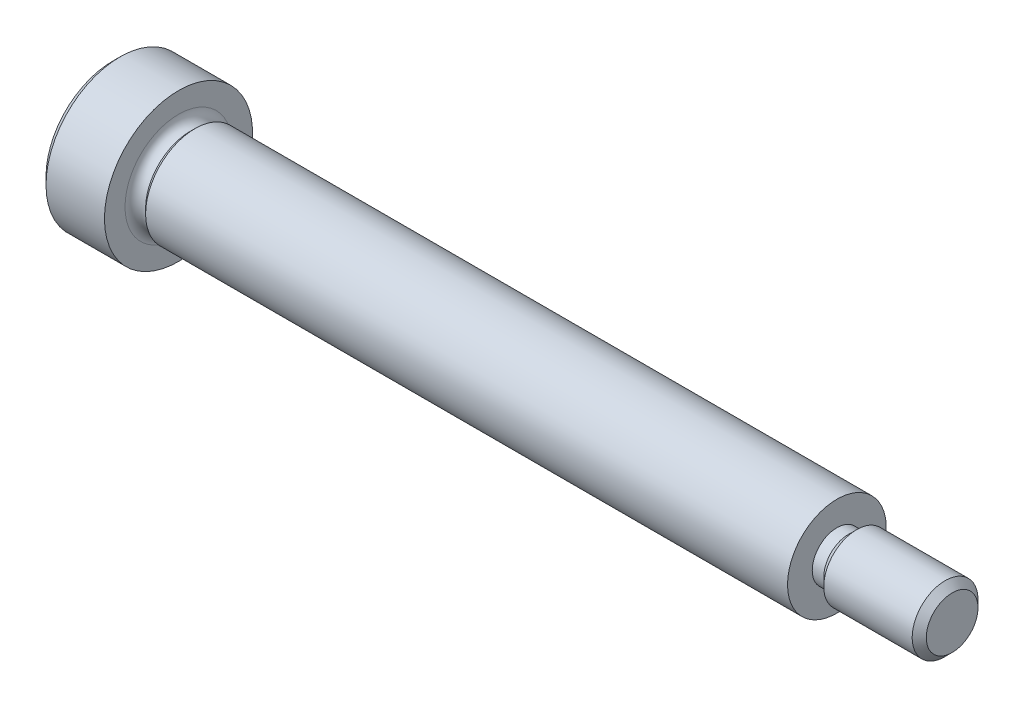
ISO-10303-21;
HEADER;
FILE_DESCRIPTION(('STEP AP214'),'2;1');
FILE_NAME('part.step','',(''),(''),'','','');
FILE_SCHEMA(('AUTOMOTIVE_DESIGN { 1 0 10303 214 1 1 1 1 }'));
ENDSEC;
DATA;
#1=APPLICATION_CONTEXT('core data for automotive mechanical design processes');
#2=APPLICATION_PROTOCOL_DEFINITION('international standard','automotive_design',2000,#1);
#3=PRODUCT_CONTEXT('',#1,'mechanical');
#4=PRODUCT('Part','Part','',(#3));
#5=PRODUCT_RELATED_PRODUCT_CATEGORY('part','',(#4));
#6=PRODUCT_DEFINITION_FORMATION('','',#4);
#7=PRODUCT_DEFINITION_CONTEXT('part definition',#1,'design');
#8=PRODUCT_DEFINITION('design','',#6,#7);
#9=PRODUCT_DEFINITION_SHAPE('','',#8);
#10=(LENGTH_UNIT() NAMED_UNIT(*) SI_UNIT(.MILLI.,.METRE.));
#11=(NAMED_UNIT(*) PLANE_ANGLE_UNIT() SI_UNIT($,.RADIAN.));
#12=(NAMED_UNIT(*) SI_UNIT($,.STERADIAN.) SOLID_ANGLE_UNIT());
#13=UNCERTAINTY_MEASURE_WITH_UNIT(LENGTH_MEASURE(1.E-05),#10,'distance_accuracy_value','');
#14=(GEOMETRIC_REPRESENTATION_CONTEXT(3) GLOBAL_UNCERTAINTY_ASSIGNED_CONTEXT((#13)) GLOBAL_UNIT_ASSIGNED_CONTEXT((#10,
#11,#12)) REPRESENTATION_CONTEXT('',''));
#15=CARTESIAN_POINT('',(0.,0.,0.));
#16=DIRECTION('',(0.,0.,1.));
#17=DIRECTION('',(1.,0.,0.));
#18=AXIS2_PLACEMENT_3D('',#15,#16,#17);
#19=CARTESIAN_POINT('',(-4.,1.5,0.));
#20=DIRECTION('',(1.,0.,0.));
#21=DIRECTION('',(0.,0.,-1.));
#22=AXIS2_PLACEMENT_3D('',#19,#20,#21);
#23=PLANE('',#22);
#24=CARTESIAN_POINT('',(-4.,0.,0.));
#25=DIRECTION('',(-1.,0.,0.));
#26=DIRECTION('',(0.,0.,1.));
#27=AXIS2_PLACEMENT_3D('',#24,#25,#26);
#28=CIRCLE('',#27,4.05);
#29=CARTESIAN_POINT('',(-4.,0.,4.05));
#30=VERTEX_POINT('',#29);
#31=EDGE_CURVE('E148',#30,#30,#28,.T.);
#32=ORIENTED_EDGE('',*,*,#31,.T.);
#33=EDGE_LOOP('',(#32));
#34=FACE_BOUND('',#33,.T.);
#35=DIRECTION('',(0.,-0.500000000000009,-0.866025403784433));
#36=VECTOR('',#35,1.);
#37=CARTESIAN_POINT('',(-4.,-0.86602540378444,1.5));
#38=LINE('',#37,#36);
#39=CARTESIAN_POINT('',(-4.,-0.86602540378444,1.5));
#40=VERTEX_POINT('',#39);
#41=CARTESIAN_POINT('',(-4.,-1.7320508075689,0.));
#42=VERTEX_POINT('',#41);
#43=EDGE_CURVE('E461',#40,#42,#38,.T.);
#44=ORIENTED_EDGE('',*,*,#43,.T.);
#45=DIRECTION('',(0.,0.500000000000009,-0.866025403784433));
#46=VECTOR('',#45,1.);
#47=CARTESIAN_POINT('',(-4.,-1.7320508075689,0.));
#48=LINE('',#47,#46);
#49=CARTESIAN_POINT('',(-4.,-0.86602540378444,-1.5));
#50=VERTEX_POINT('',#49);
#51=EDGE_CURVE('E464',#42,#50,#48,.T.);
#52=ORIENTED_EDGE('',*,*,#51,.T.);
#53=DIRECTION('',(0.,1.,0.));
#54=VECTOR('',#53,1.);
#55=CARTESIAN_POINT('',(-4.,-0.86602540378444,-1.5));
#56=LINE('',#55,#54);
#57=CARTESIAN_POINT('',(-4.,0.86602540378444,-1.5));
#58=VERTEX_POINT('',#57);
#59=EDGE_CURVE('E467',#50,#58,#56,.T.);
#60=ORIENTED_EDGE('',*,*,#59,.T.);
#61=DIRECTION('',(0.,0.500000000000009,0.866025403784433));
#62=VECTOR('',#61,1.);
#63=CARTESIAN_POINT('',(-4.,0.86602540378444,-1.5));
#64=LINE('',#63,#62);
#65=CARTESIAN_POINT('',(-4.,1.7320508075689,0.));
#66=VERTEX_POINT('',#65);
#67=EDGE_CURVE('E123',#58,#66,#64,.T.);
#68=ORIENTED_EDGE('',*,*,#67,.T.);
#69=DIRECTION('',(0.,-0.500000000000009,0.866025403784433));
#70=VECTOR('',#69,1.);
#71=CARTESIAN_POINT('',(-4.,1.7320508075689,0.));
#72=LINE('',#71,#70);
#73=CARTESIAN_POINT('',(-4.,0.86602540378444,1.5));
#74=VERTEX_POINT('',#73);
#75=EDGE_CURVE('E458',#66,#74,#72,.T.);
#76=ORIENTED_EDGE('',*,*,#75,.T.);
#77=DIRECTION('',(0.,-1.,0.));
#78=VECTOR('',#77,1.);
#79=CARTESIAN_POINT('',(-4.,0.86602540378444,1.5));
#80=LINE('',#79,#78);
#81=EDGE_CURVE('E138',#74,#40,#80,.T.);
#82=ORIENTED_EDGE('',*,*,#81,.T.);
#83=EDGE_LOOP('',(#44,#52,#60,#68,#76,#82));
#84=FACE_BOUND('',#83,.T.);
#85=ADVANCED_FACE('F39',(#34,#84),#23,.F.);
#86=CARTESIAN_POINT('',(47.,1.5705,0.));
#87=DIRECTION('',(-1.,0.,0.));
#88=DIRECTION('',(0.,0.,1.));
#89=AXIS2_PLACEMENT_3D('',#86,#87,#88);
#90=PLANE('',#89);
#91=CARTESIAN_POINT('',(47.,0.,0.));
#92=DIRECTION('',(-1.,0.,0.));
#93=DIRECTION('',(0.,0.,1.));
#94=AXIS2_PLACEMENT_3D('',#91,#92,#93);
#95=CIRCLE('',#94,1.5705);
#96=CARTESIAN_POINT('',(47.,0.,1.5705));
#97=VERTEX_POINT('',#96);
#98=EDGE_CURVE('E11',#97,#97,#95,.T.);
#99=ORIENTED_EDGE('',*,*,#98,.F.);
#100=EDGE_LOOP('',(#99));
#101=FACE_BOUND('',#100,.T.);
#102=ADVANCED_FACE('F41',(#101),#90,.F.);
#103=CARTESIAN_POINT('',(47.,0.,0.));
#104=DIRECTION('',(-1.,0.,0.));
#105=DIRECTION('',(0.,0.,1.));
#106=AXIS2_PLACEMENT_3D('',#103,#104,#105);
#107=CONICAL_SURFACE('',#106,1.5705,0.785398163397449);
#108=CARTESIAN_POINT('',(46.5705,0.,0.));
#109=DIRECTION('',(-1.,0.,0.));
#110=DIRECTION('',(0.,0.,1.));
#111=AXIS2_PLACEMENT_3D('',#108,#109,#110);
#112=CIRCLE('',#111,2.);
#113=CARTESIAN_POINT('',(46.5705,0.,2.));
#114=VERTEX_POINT('',#113);
#115=EDGE_CURVE('E47',#114,#114,#112,.T.);
#116=ORIENTED_EDGE('',*,*,#115,.F.);
#117=EDGE_LOOP('',(#116));
#118=FACE_BOUND('',#117,.T.);
#119=ORIENTED_EDGE('',*,*,#98,.T.);
#120=EDGE_LOOP('',(#119));
#121=FACE_BOUND('',#120,.T.);
#122=ADVANCED_FACE('F183',(#118,#121),#107,.T.);
#123=CARTESIAN_POINT('',(47.,0.,0.));
#124=DIRECTION('',(-1.,0.,0.));
#125=DIRECTION('',(0.,0.,1.));
#126=AXIS2_PLACEMENT_3D('',#123,#124,#125);
#127=CYLINDRICAL_SURFACE('',#126,2.);
#128=CARTESIAN_POINT('',(41.2,0.,0.));
#129=DIRECTION('',(-1.,0.,0.));
#130=DIRECTION('',(0.,0.,1.));
#131=AXIS2_PLACEMENT_3D('',#128,#129,#130);
#132=CIRCLE('',#131,2.);
#133=CARTESIAN_POINT('',(41.2,0.,2.));
#134=VERTEX_POINT('',#133);
#135=EDGE_CURVE('E176',#134,#134,#132,.T.);
#136=ORIENTED_EDGE('',*,*,#135,.F.);
#137=EDGE_LOOP('',(#136));
#138=FACE_BOUND('',#137,.T.);
#139=ORIENTED_EDGE('',*,*,#115,.T.);
#140=EDGE_LOOP('',(#139));
#141=FACE_BOUND('',#140,.T.);
#142=ADVANCED_FACE('F181',(#138,#141),#127,.T.);
#143=CARTESIAN_POINT('',(41.2,0.,0.));
#144=DIRECTION('',(1.,0.,0.));
#145=DIRECTION('',(0.,0.,-1.));
#146=AXIS2_PLACEMENT_3D('',#143,#144,#145);
#147=CONICAL_SURFACE('',#146,2.,0.785398163397448);
#148=CARTESIAN_POINT('',(40.7,0.,0.));
#149=DIRECTION('',(-1.,0.,0.));
#150=DIRECTION('',(0.,0.,1.));
#151=AXIS2_PLACEMENT_3D('',#148,#149,#150);
#152=CIRCLE('',#151,1.5);
#153=CARTESIAN_POINT('',(40.7,0.,1.5));
#154=VERTEX_POINT('',#153);
#155=EDGE_CURVE('E173',#154,#154,#152,.T.);
#156=ORIENTED_EDGE('',*,*,#155,.F.);
#157=EDGE_LOOP('',(#156));
#158=FACE_BOUND('',#157,.T.);
#159=ORIENTED_EDGE('',*,*,#135,.T.);
#160=EDGE_LOOP('',(#159));
#161=FACE_BOUND('',#160,.T.);
#162=ADVANCED_FACE('F232',(#158,#161),#147,.T.);
#163=CARTESIAN_POINT('',(47.,0.,0.));
#164=DIRECTION('',(-1.,0.,0.));
#165=DIRECTION('',(0.,0.,1.));
#166=AXIS2_PLACEMENT_3D('',#163,#164,#165);
#167=CYLINDRICAL_SURFACE('',#166,1.5);
#168=CARTESIAN_POINT('',(40.,0.,0.));
#169=DIRECTION('',(-1.,0.,0.));
#170=DIRECTION('',(0.,0.,1.));
#171=AXIS2_PLACEMENT_3D('',#168,#169,#170);
#172=CIRCLE('',#171,1.5);
#173=CARTESIAN_POINT('',(40.,0.,1.5));
#174=VERTEX_POINT('',#173);
#175=EDGE_CURVE('E170',#174,#174,#172,.T.);
#176=ORIENTED_EDGE('',*,*,#175,.F.);
#177=EDGE_LOOP('',(#176));
#178=FACE_BOUND('',#177,.T.);
#179=ORIENTED_EDGE('',*,*,#155,.T.);
#180=EDGE_LOOP('',(#179));
#181=FACE_BOUND('',#180,.T.);
#182=ADVANCED_FACE('F228',(#178,#181),#167,.T.);
#183=CARTESIAN_POINT('',(40.,3.,0.));
#184=DIRECTION('',(-1.,0.,0.));
#185=DIRECTION('',(0.,0.,1.));
#186=AXIS2_PLACEMENT_3D('',#183,#184,#185);
#187=PLANE('',#186);
#188=CARTESIAN_POINT('',(40.,0.,0.));
#189=DIRECTION('',(-1.,0.,0.));
#190=DIRECTION('',(0.,0.,1.));
#191=AXIS2_PLACEMENT_3D('',#188,#189,#190);
#192=CIRCLE('',#191,3.);
#193=CARTESIAN_POINT('',(40.,0.,3.));
#194=VERTEX_POINT('',#193);
#195=EDGE_CURVE('E167',#194,#194,#192,.T.);
#196=ORIENTED_EDGE('',*,*,#195,.F.);
#197=EDGE_LOOP('',(#196));
#198=FACE_BOUND('',#197,.T.);
#199=ORIENTED_EDGE('',*,*,#175,.T.);
#200=EDGE_LOOP('',(#199));
#201=FACE_BOUND('',#200,.T.);
#202=ADVANCED_FACE('F224',(#198,#201),#187,.F.);
#203=CARTESIAN_POINT('',(47.,0.,0.));
#204=DIRECTION('',(-1.,0.,0.));
#205=DIRECTION('',(0.,0.,1.));
#206=AXIS2_PLACEMENT_3D('',#203,#204,#205);
#207=CYLINDRICAL_SURFACE('',#206,3.);
#208=CARTESIAN_POINT('',(1.,0.,0.));
#209=DIRECTION('',(-1.,0.,0.));
#210=DIRECTION('',(0.,0.,1.));
#211=AXIS2_PLACEMENT_3D('',#208,#209,#210);
#212=CIRCLE('',#211,3.);
#213=CARTESIAN_POINT('',(1.,0.,3.));
#214=VERTEX_POINT('',#213);
#215=EDGE_CURVE('E164',#214,#214,#212,.T.);
#216=ORIENTED_EDGE('',*,*,#215,.F.);
#217=EDGE_LOOP('',(#216));
#218=FACE_BOUND('',#217,.T.);
#219=ORIENTED_EDGE('',*,*,#195,.T.);
#220=EDGE_LOOP('',(#219));
#221=FACE_BOUND('',#220,.T.);
#222=ADVANCED_FACE('F220',(#218,#221),#207,.T.);
#223=CARTESIAN_POINT('',(1.,0.,0.));
#224=DIRECTION('',(1.,0.,0.));
#225=DIRECTION('',(0.,0.,-1.));
#226=AXIS2_PLACEMENT_3D('',#223,#224,#225);
#227=CONICAL_SURFACE('',#226,3.,0.785398163397445);
#228=CARTESIAN_POINT('',(0.699999999999999,0.,0.));
#229=DIRECTION('',(-1.,0.,0.));
#230=DIRECTION('',(0.,0.,1.));
#231=AXIS2_PLACEMENT_3D('',#228,#229,#230);
#232=CIRCLE('',#231,2.7);
#233=CARTESIAN_POINT('',(0.699999999999999,0.,2.7));
#234=VERTEX_POINT('',#233);
#235=EDGE_CURVE('E161',#234,#234,#232,.T.);
#236=ORIENTED_EDGE('',*,*,#235,.F.);
#237=EDGE_LOOP('',(#236));
#238=FACE_BOUND('',#237,.T.);
#239=ORIENTED_EDGE('',*,*,#215,.T.);
#240=EDGE_LOOP('',(#239));
#241=FACE_BOUND('',#240,.T.);
#242=ADVANCED_FACE('F216',(#238,#241),#227,.T.);
#243=CARTESIAN_POINT('',(0.574890439501512,0.,0.));
#244=DIRECTION('',(-1.,0.,0.));
#245=DIRECTION('',(0.,0.,1.));
#246=AXIS2_PLACEMENT_3D('',#243,#244,#245);
#247=TOROIDAL_SURFACE('',#246,3.2612241957292,0.575000000000008);
#248=CARTESIAN_POINT('',(0.,0.,0.));
#249=DIRECTION('',(-1.,0.,0.));
#250=DIRECTION('',(0.,0.,1.));
#251=AXIS2_PLACEMENT_3D('',#248,#249,#250);
#252=CIRCLE('',#251,3.25);
#253=CARTESIAN_POINT('',(0.,0.,3.25));
#254=VERTEX_POINT('',#253);
#255=EDGE_CURVE('E158',#254,#254,#252,.T.);
#256=ORIENTED_EDGE('',*,*,#255,.F.);
#257=EDGE_LOOP('',(#256));
#258=FACE_BOUND('',#257,.T.);
#259=ORIENTED_EDGE('',*,*,#235,.T.);
#260=EDGE_LOOP('',(#259));
#261=FACE_BOUND('',#260,.T.);
#262=ADVANCED_FACE('F212',(#258,#261),#247,.F.);
#263=CARTESIAN_POINT('',(0.,4.5,0.));
#264=DIRECTION('',(-1.,0.,0.));
#265=DIRECTION('',(0.,0.,1.));
#266=AXIS2_PLACEMENT_3D('',#263,#264,#265);
#267=PLANE('',#266);
#268=CARTESIAN_POINT('',(0.,0.,0.));
#269=DIRECTION('',(-1.,0.,0.));
#270=DIRECTION('',(0.,0.,1.));
#271=AXIS2_PLACEMENT_3D('',#268,#269,#270);
#272=CIRCLE('',#271,4.5);
#273=CARTESIAN_POINT('',(0.,0.,4.5));
#274=VERTEX_POINT('',#273);
#275=EDGE_CURVE('E155',#274,#274,#272,.T.);
#276=ORIENTED_EDGE('',*,*,#275,.F.);
#277=EDGE_LOOP('',(#276));
#278=FACE_BOUND('',#277,.T.);
#279=ORIENTED_EDGE('',*,*,#255,.T.);
#280=EDGE_LOOP('',(#279));
#281=FACE_BOUND('',#280,.T.);
#282=ADVANCED_FACE('F208',(#278,#281),#267,.F.);
#283=CARTESIAN_POINT('',(47.,0.,0.));
#284=DIRECTION('',(-1.,0.,0.));
#285=DIRECTION('',(0.,0.,1.));
#286=AXIS2_PLACEMENT_3D('',#283,#284,#285);
#287=CYLINDRICAL_SURFACE('',#286,4.5);
#288=CARTESIAN_POINT('',(-3.55,0.,0.));
#289=DIRECTION('',(-1.,0.,0.));
#290=DIRECTION('',(0.,0.,1.));
#291=AXIS2_PLACEMENT_3D('',#288,#289,#290);
#292=CIRCLE('',#291,4.5);
#293=CARTESIAN_POINT('',(-3.55,0.,4.5));
#294=VERTEX_POINT('',#293);
#295=EDGE_CURVE('E152',#294,#294,#292,.T.);
#296=ORIENTED_EDGE('',*,*,#295,.F.);
#297=EDGE_LOOP('',(#296));
#298=FACE_BOUND('',#297,.T.);
#299=ORIENTED_EDGE('',*,*,#275,.T.);
#300=EDGE_LOOP('',(#299));
#301=FACE_BOUND('',#300,.T.);
#302=ADVANCED_FACE('F204',(#298,#301),#287,.T.);
#303=CARTESIAN_POINT('',(-3.55,0.,0.));
#304=DIRECTION('',(1.,0.,0.));
#305=DIRECTION('',(0.,0.,-1.));
#306=AXIS2_PLACEMENT_3D('',#303,#304,#305);
#307=CONICAL_SURFACE('',#306,4.5,0.785398163397442);
#308=ORIENTED_EDGE('',*,*,#31,.F.);
#309=EDGE_LOOP('',(#308));
#310=FACE_BOUND('',#309,.T.);
#311=ORIENTED_EDGE('',*,*,#295,.T.);
#312=EDGE_LOOP('',(#311));
#313=FACE_BOUND('',#312,.T.);
#314=ADVANCED_FACE('F201',(#310,#313),#307,.T.);
#315=CARTESIAN_POINT('',(-2.,1.7320508075689,0.));
#316=DIRECTION('',(0.,-0.866025403784433,-0.500000000000009));
#317=DIRECTION('',(0.,0.500000000000009,-0.866025403784433));
#318=AXIS2_PLACEMENT_3D('',#315,#316,#317);
#319=PLANE('',#318);
#320=ORIENTED_EDGE('',*,*,#75,.F.);
#321=DIRECTION('',(-1.,0.,0.));
#322=VECTOR('',#321,1.);
#323=CARTESIAN_POINT('',(-2.,1.7320508075689,0.));
#324=LINE('',#323,#322);
#325=CARTESIAN_POINT('',(-2.,1.7320508075689,0.));
#326=VERTEX_POINT('',#325);
#327=EDGE_CURVE('E457',#326,#66,#324,.T.);
#328=ORIENTED_EDGE('',*,*,#327,.F.);
#329=DIRECTION('',(0.,-0.500000000000009,0.866025403784433));
#330=VECTOR('',#329,1.);
#331=CARTESIAN_POINT('',(-2.,1.7320508075689,0.));
#332=LINE('',#331,#330);
#333=CARTESIAN_POINT('',(-2.,1.29903810567666,0.750000000000019));
#334=VERTEX_POINT('',#333);
#335=EDGE_CURVE('E120',#326,#334,#332,.T.);
#336=ORIENTED_EDGE('',*,*,#335,.T.);
#337=CARTESIAN_POINT('',(-2.,0.86602540378444,1.5));
#338=VERTEX_POINT('',#337);
#339=EDGE_CURVE('E112',#334,#338,#332,.T.);
#340=ORIENTED_EDGE('',*,*,#339,.T.);
#341=DIRECTION('',(-1.,0.,0.));
#342=VECTOR('',#341,1.);
#343=CARTESIAN_POINT('',(-2.,0.86602540378444,1.5));
#344=LINE('',#343,#342);
#345=EDGE_CURVE('E116',#338,#74,#344,.T.);
#346=ORIENTED_EDGE('',*,*,#345,.T.);
#347=EDGE_LOOP('',(#320,#328,#336,#340,#346));
#348=FACE_BOUND('',#347,.T.);
#349=ADVANCED_FACE('F114',(#348),#319,.T.);
#350=CARTESIAN_POINT('',(-2.,0.86602540378444,1.5));
#351=DIRECTION('',(0.,0.,-1.));
#352=DIRECTION('',(-1.,0.,0.));
#353=AXIS2_PLACEMENT_3D('',#350,#351,#352);
#354=PLANE('',#353);
#355=ORIENTED_EDGE('',*,*,#81,.F.);
#356=ORIENTED_EDGE('',*,*,#345,.F.);
#357=DIRECTION('',(0.,-1.,0.));
#358=VECTOR('',#357,1.);
#359=CARTESIAN_POINT('',(-2.,0.86602540378444,1.5));
#360=LINE('',#359,#358);
#361=CARTESIAN_POINT('',(-2.,0.,1.5));
#362=VERTEX_POINT('',#361);
#363=EDGE_CURVE('E126',#338,#362,#360,.T.);
#364=ORIENTED_EDGE('',*,*,#363,.T.);
#365=CARTESIAN_POINT('',(-2.,-0.86602540378444,1.5));
#366=VERTEX_POINT('',#365);
#367=EDGE_CURVE('E133',#362,#366,#360,.T.);
#368=ORIENTED_EDGE('',*,*,#367,.T.);
#369=DIRECTION('',(-1.,0.,0.));
#370=VECTOR('',#369,1.);
#371=CARTESIAN_POINT('',(-2.,-0.86602540378444,1.5));
#372=LINE('',#371,#370);
#373=EDGE_CURVE('E140',#366,#40,#372,.T.);
#374=ORIENTED_EDGE('',*,*,#373,.T.);
#375=EDGE_LOOP('',(#355,#356,#364,#368,#374));
#376=FACE_BOUND('',#375,.T.);
#377=ADVANCED_FACE('F135',(#376),#354,.T.);
#378=CARTESIAN_POINT('',(-2.,-0.86602540378444,1.5));
#379=DIRECTION('',(0.,0.866025403784433,-0.500000000000009));
#380=DIRECTION('',(0.,0.500000000000009,0.866025403784433));
#381=AXIS2_PLACEMENT_3D('',#378,#379,#380);
#382=PLANE('',#381);
#383=ORIENTED_EDGE('',*,*,#43,.F.);
#384=ORIENTED_EDGE('',*,*,#373,.F.);
#385=DIRECTION('',(0.,-0.500000000000009,-0.866025403784433));
#386=VECTOR('',#385,1.);
#387=CARTESIAN_POINT('',(-2.,-0.86602540378444,1.5));
#388=LINE('',#387,#386);
#389=CARTESIAN_POINT('',(-2.,-1.29903810567666,0.750000000000019));
#390=VERTEX_POINT('',#389);
#391=EDGE_CURVE('E439',#366,#390,#388,.T.);
#392=ORIENTED_EDGE('',*,*,#391,.T.);
#393=CARTESIAN_POINT('',(-2.,-1.7320508075689,0.));
#394=VERTEX_POINT('',#393);
#395=EDGE_CURVE('E132',#390,#394,#388,.T.);
#396=ORIENTED_EDGE('',*,*,#395,.T.);
#397=DIRECTION('',(-1.,0.,0.));
#398=VECTOR('',#397,1.);
#399=CARTESIAN_POINT('',(-2.,-1.7320508075689,0.));
#400=LINE('',#399,#398);
#401=EDGE_CURVE('E144',#394,#42,#400,.T.);
#402=ORIENTED_EDGE('',*,*,#401,.T.);
#403=EDGE_LOOP('',(#383,#384,#392,#396,#402));
#404=FACE_BOUND('',#403,.T.);
#405=ADVANCED_FACE('F292',(#404),#382,.T.);
#406=CARTESIAN_POINT('',(-2.,-1.7320508075689,0.));
#407=DIRECTION('',(0.,0.866025403784433,0.500000000000009));
#408=DIRECTION('',(0.,-0.500000000000009,0.866025403784433));
#409=AXIS2_PLACEMENT_3D('',#406,#407,#408);
#410=PLANE('',#409);
#411=ORIENTED_EDGE('',*,*,#51,.F.);
#412=ORIENTED_EDGE('',*,*,#401,.F.);
#413=DIRECTION('',(0.,0.500000000000009,-0.866025403784433));
#414=VECTOR('',#413,1.);
#415=CARTESIAN_POINT('',(-2.,-1.7320508075689,0.));
#416=LINE('',#415,#414);
#417=CARTESIAN_POINT('',(-2.,-1.29903810567666,-0.750000000000019));
#418=VERTEX_POINT('',#417);
#419=EDGE_CURVE('E443',#394,#418,#416,.T.);
#420=ORIENTED_EDGE('',*,*,#419,.T.);
#421=CARTESIAN_POINT('',(-2.,-0.86602540378444,-1.5));
#422=VERTEX_POINT('',#421);
#423=EDGE_CURVE('E448',#418,#422,#416,.T.);
#424=ORIENTED_EDGE('',*,*,#423,.T.);
#425=DIRECTION('',(-1.,0.,0.));
#426=VECTOR('',#425,1.);
#427=CARTESIAN_POINT('',(-2.,-0.86602540378444,-1.5));
#428=LINE('',#427,#426);
#429=EDGE_CURVE('E477',#422,#50,#428,.T.);
#430=ORIENTED_EDGE('',*,*,#429,.T.);
#431=EDGE_LOOP('',(#411,#412,#420,#424,#430));
#432=FACE_BOUND('',#431,.T.);
#433=ADVANCED_FACE('F299',(#432),#410,.T.);
#434=CARTESIAN_POINT('',(-2.,-0.86602540378444,-1.5));
#435=DIRECTION('',(0.,0.,1.));
#436=DIRECTION('',(1.,0.,0.));
#437=AXIS2_PLACEMENT_3D('',#434,#435,#436);
#438=PLANE('',#437);
#439=ORIENTED_EDGE('',*,*,#59,.F.);
#440=ORIENTED_EDGE('',*,*,#429,.F.);
#441=DIRECTION('',(0.,1.,0.));
#442=VECTOR('',#441,1.);
#443=CARTESIAN_POINT('',(-2.,-0.86602540378444,-1.5));
#444=LINE('',#443,#442);
#445=CARTESIAN_POINT('',(-2.,0.,-1.5));
#446=VERTEX_POINT('',#445);
#447=EDGE_CURVE('E54',#422,#446,#444,.T.);
#448=ORIENTED_EDGE('',*,*,#447,.T.);
#449=CARTESIAN_POINT('',(-2.,0.86602540378444,-1.5));
#450=VERTEX_POINT('',#449);
#451=EDGE_CURVE('E451',#446,#450,#444,.T.);
#452=ORIENTED_EDGE('',*,*,#451,.T.);
#453=DIRECTION('',(-1.,0.,0.));
#454=VECTOR('',#453,1.);
#455=CARTESIAN_POINT('',(-2.,0.86602540378444,-1.5));
#456=LINE('',#455,#454);
#457=EDGE_CURVE('E474',#450,#58,#456,.T.);
#458=ORIENTED_EDGE('',*,*,#457,.T.);
#459=EDGE_LOOP('',(#439,#440,#448,#452,#458));
#460=FACE_BOUND('',#459,.T.);
#461=ADVANCED_FACE('F307',(#460),#438,.T.);
#462=CARTESIAN_POINT('',(-2.,0.86602540378444,-1.5));
#463=DIRECTION('',(0.,-0.866025403784433,0.500000000000009));
#464=DIRECTION('',(0.,-0.500000000000009,-0.866025403784433));
#465=AXIS2_PLACEMENT_3D('',#462,#463,#464);
#466=PLANE('',#465);
#467=ORIENTED_EDGE('',*,*,#67,.F.);
#468=ORIENTED_EDGE('',*,*,#457,.F.);
#469=DIRECTION('',(0.,0.500000000000009,0.866025403784433));
#470=VECTOR('',#469,1.);
#471=CARTESIAN_POINT('',(-2.,0.86602540378444,-1.5));
#472=LINE('',#471,#470);
#473=CARTESIAN_POINT('',(-2.,1.29903810567666,-0.750000000000019));
#474=VERTEX_POINT('',#473);
#475=EDGE_CURVE('E454',#450,#474,#472,.T.);
#476=ORIENTED_EDGE('',*,*,#475,.T.);
#477=EDGE_CURVE('E453',#474,#326,#472,.T.);
#478=ORIENTED_EDGE('',*,*,#477,.T.);
#479=ORIENTED_EDGE('',*,*,#327,.T.);
#480=EDGE_LOOP('',(#467,#468,#476,#478,#479));
#481=FACE_BOUND('',#480,.T.);
#482=ADVANCED_FACE('F315',(#481),#466,.T.);
#483=CARTESIAN_POINT('',(-2.,0.,0.));
#484=DIRECTION('',(1.,0.,0.));
#485=DIRECTION('',(0.,0.,-1.));
#486=AXIS2_PLACEMENT_3D('',#483,#484,#485);
#487=PLANE('',#486);
#488=ORIENTED_EDGE('',*,*,#447,.F.);
#489=ORIENTED_EDGE('',*,*,#423,.F.);
#490=CARTESIAN_POINT('',(-2.,0.,0.));
#491=DIRECTION('',(-1.,0.,0.));
#492=DIRECTION('',(0.,0.,1.));
#493=AXIS2_PLACEMENT_3D('',#490,#491,#492);
#494=CIRCLE('',#493,1.5);
#495=EDGE_CURVE('E483',#446,#418,#494,.T.);
#496=ORIENTED_EDGE('',*,*,#495,.F.);
#497=EDGE_LOOP('',(#488,#489,#496));
#498=FACE_BOUND('',#497,.T.);
#499=ADVANCED_FACE('F322',(#498),#487,.F.);
#500=ORIENTED_EDGE('',*,*,#419,.F.);
#501=ORIENTED_EDGE('',*,*,#395,.F.);
#502=EDGE_CURVE('E142',#418,#390,#494,.T.);
#503=ORIENTED_EDGE('',*,*,#502,.F.);
#504=EDGE_LOOP('',(#500,#501,#503));
#505=FACE_BOUND('',#504,.T.);
#506=ADVANCED_FACE('F330',(#505),#487,.F.);
#507=ORIENTED_EDGE('',*,*,#391,.F.);
#508=ORIENTED_EDGE('',*,*,#367,.F.);
#509=EDGE_CURVE('E139',#390,#362,#494,.T.);
#510=ORIENTED_EDGE('',*,*,#509,.F.);
#511=EDGE_LOOP('',(#507,#508,#510));
#512=FACE_BOUND('',#511,.T.);
#513=ADVANCED_FACE('F339',(#512),#487,.F.);
#514=ORIENTED_EDGE('',*,*,#363,.F.);
#515=ORIENTED_EDGE('',*,*,#339,.F.);
#516=EDGE_CURVE('E128',#362,#334,#494,.T.);
#517=ORIENTED_EDGE('',*,*,#516,.F.);
#518=EDGE_LOOP('',(#514,#515,#517));
#519=FACE_BOUND('',#518,.T.);
#520=ADVANCED_FACE('F127',(#519),#487,.F.);
#521=ORIENTED_EDGE('',*,*,#335,.F.);
#522=ORIENTED_EDGE('',*,*,#477,.F.);
#523=EDGE_CURVE('E149',#334,#474,#494,.T.);
#524=ORIENTED_EDGE('',*,*,#523,.F.);
#525=EDGE_LOOP('',(#521,#522,#524));
#526=FACE_BOUND('',#525,.T.);
#527=ADVANCED_FACE('F352',(#526),#487,.F.);
#528=ORIENTED_EDGE('',*,*,#475,.F.);
#529=ORIENTED_EDGE('',*,*,#451,.F.);
#530=EDGE_CURVE('E482',#474,#446,#494,.T.);
#531=ORIENTED_EDGE('',*,*,#530,.F.);
#532=EDGE_LOOP('',(#528,#529,#531));
#533=FACE_BOUND('',#532,.T.);
#534=ADVANCED_FACE('F333',(#533),#487,.F.);
#535=CARTESIAN_POINT('',(-2.,0.,0.));
#536=DIRECTION('',(-1.,0.,0.));
#537=DIRECTION('',(0.,0.,1.));
#538=AXIS2_PLACEMENT_3D('',#535,#536,#537);
#539=CONICAL_SURFACE('',#538,1.5,1.04719755119662);
#540=CARTESIAN_POINT('',(-1.1339745962156,0.,0.));
#541=VERTEX_POINT('',#540);
#542=VERTEX_LOOP('',#541);
#543=FACE_BOUND('',#542,.T.);
#544=ORIENTED_EDGE('',*,*,#516,.T.);
#545=ORIENTED_EDGE('',*,*,#523,.T.);
#546=ORIENTED_EDGE('',*,*,#530,.T.);
#547=ORIENTED_EDGE('',*,*,#495,.T.);
#548=ORIENTED_EDGE('',*,*,#502,.T.);
#549=ORIENTED_EDGE('',*,*,#509,.T.);
#550=EDGE_LOOP('',(#544,#545,#546,#547,#548,#549));
#551=FACE_BOUND('',#550,.T.);
#552=ADVANCED_FACE('F199',(#543,#551),#539,.F.);
#553=CLOSED_SHELL('',(#85,#102,#122,#142,#162,#182,#202,#222,#242,#262,#282,#302,#314,#349,#377,
#405,#433,#461,#482,#499,#506,#513,#520,#527,#534,#552));
#554=MANIFOLD_SOLID_BREP('B2',#553);
#555=ADVANCED_BREP_SHAPE_REPRESENTATION('',(#18,#554),#14);
#556=SHAPE_DEFINITION_REPRESENTATION(#9,#555);
ENDSEC;
END-ISO-10303-21;
